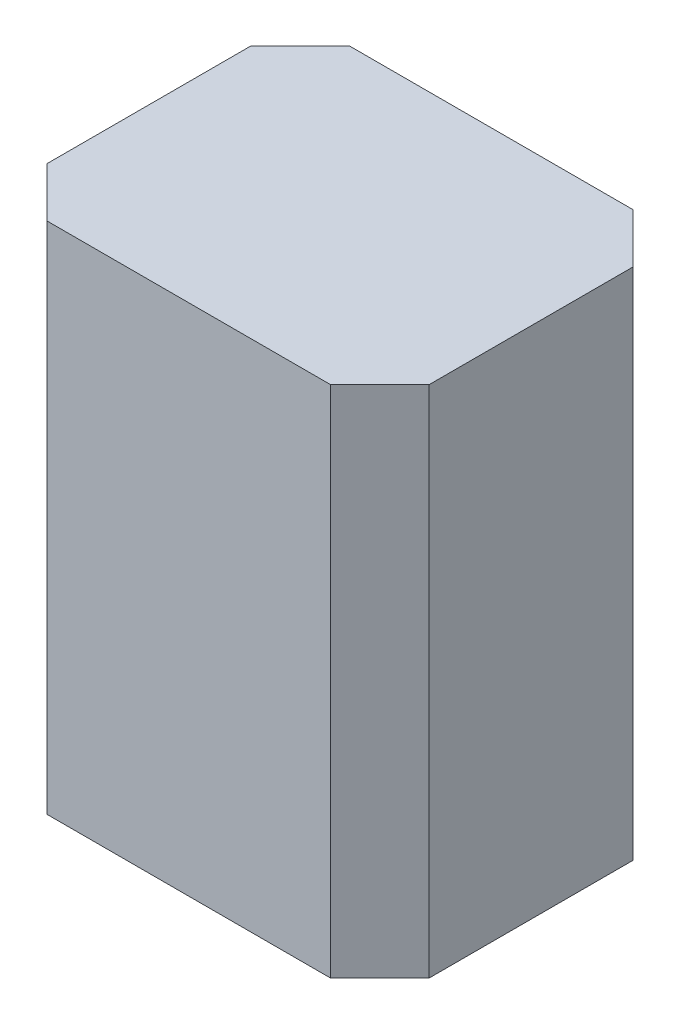
ISO-10303-21;
HEADER;
FILE_DESCRIPTION(('STEP AP214'),'2;1');
FILE_NAME('part.step','',(''),(''),'','','');
FILE_SCHEMA(('AUTOMOTIVE_DESIGN { 1 0 10303 214 1 1 1 1 }'));
ENDSEC;
DATA;
#1=APPLICATION_CONTEXT('core data for automotive mechanical design processes');
#2=APPLICATION_PROTOCOL_DEFINITION('international standard','automotive_design',2000,#1);
#3=PRODUCT_CONTEXT('',#1,'mechanical');
#4=PRODUCT('Part','Part','',(#3));
#5=PRODUCT_RELATED_PRODUCT_CATEGORY('part','',(#4));
#6=PRODUCT_DEFINITION_FORMATION('','',#4);
#7=PRODUCT_DEFINITION_CONTEXT('part definition',#1,'design');
#8=PRODUCT_DEFINITION('design','',#6,#7);
#9=PRODUCT_DEFINITION_SHAPE('','',#8);
#10=(LENGTH_UNIT() NAMED_UNIT(*) SI_UNIT(.MILLI.,.METRE.));
#11=(NAMED_UNIT(*) PLANE_ANGLE_UNIT() SI_UNIT($,.RADIAN.));
#12=(NAMED_UNIT(*) SI_UNIT($,.STERADIAN.) SOLID_ANGLE_UNIT());
#13=UNCERTAINTY_MEASURE_WITH_UNIT(LENGTH_MEASURE(1.E-05),#10,'distance_accuracy_value','');
#14=(GEOMETRIC_REPRESENTATION_CONTEXT(3) GLOBAL_UNCERTAINTY_ASSIGNED_CONTEXT((#13)) GLOBAL_UNIT_ASSIGNED_CONTEXT((#10,
#11,#12)) REPRESENTATION_CONTEXT('',''));
#15=CARTESIAN_POINT('',(0.,0.,0.));
#16=DIRECTION('',(0.,0.,1.));
#17=DIRECTION('',(1.,0.,0.));
#18=AXIS2_PLACEMENT_3D('',#15,#16,#17);
#19=CARTESIAN_POINT('',(-115.998,-95.,29.8292555518709));
#20=DIRECTION('',(0.,1.,0.));
#21=DIRECTION('',(0.,0.,1.));
#22=AXIS2_PLACEMENT_3D('',#19,#20,#21);
#23=PLANE('',#22);
#24=DIRECTION('',(0.,0.,-1.));
#25=VECTOR('',#24,1.);
#26=CARTESIAN_POINT('',(118.,-95.,41.));
#27=LINE('',#26,#25);
#28=CARTESIAN_POINT('',(118.,-95.,31.8284271247463));
#29=VERTEX_POINT('',#28);
#30=CARTESIAN_POINT('',(118.,-95.,31.));
#31=VERTEX_POINT('',#30);
#32=EDGE_CURVE('E251',#29,#31,#27,.T.);
#33=ORIENTED_EDGE('',*,*,#32,.F.);
#34=DIRECTION('',(0.707106781186548,0.,0.707106781186548));
#35=VECTOR('',#34,1.);
#36=CARTESIAN_POINT('',(87.5857864376269,-95.,1.41421356237307));
#37=LINE('',#36,#35);
#38=CARTESIAN_POINT('',(88.1721586616914,-95.,2.00058578643758));
#39=VERTEX_POINT('',#38);
#40=EDGE_CURVE('E234',#29,#39,#37,.F.);
#41=ORIENTED_EDGE('',*,*,#40,.T.);
#42=CARTESIAN_POINT('',(88.170744448129,-95.,2.00199999999996));
#43=DIRECTION('',(0.,-1.,0.));
#44=DIRECTION('',(0.,0.,-1.));
#45=AXIS2_PLACEMENT_3D('',#42,#43,#44);
#46=CIRCLE('',#45,0.00199999999999983);
#47=CARTESIAN_POINT('',(88.170744448129,-95.,1.99999999999996));
#48=VERTEX_POINT('',#47);
#49=EDGE_CURVE('E289',#39,#48,#46,.F.);
#50=ORIENTED_EDGE('',*,*,#49,.T.);
#51=DIRECTION('',(1.,0.,0.));
#52=VECTOR('',#51,1.);
#53=CARTESIAN_POINT('',(-89.,-95.,1.99999999999997));
#54=LINE('',#53,#52);
#55=CARTESIAN_POINT('',(25.,-95.,1.99999999999997));
#56=VERTEX_POINT('',#55);
#57=EDGE_CURVE('E292',#48,#56,#54,.F.);
#58=ORIENTED_EDGE('',*,*,#57,.T.);
#59=DIRECTION('',(0.,0.,1.));
#60=VECTOR('',#59,1.);
#61=CARTESIAN_POINT('',(25.,-95.,-22.));
#62=LINE('',#61,#60);
#63=CARTESIAN_POINT('',(25.,-95.,0.));
#64=VERTEX_POINT('',#63);
#65=EDGE_CURVE('E529',#64,#56,#62,.T.);
#66=ORIENTED_EDGE('',*,*,#65,.F.);
#67=DIRECTION('',(-1.,0.,0.));
#68=VECTOR('',#67,1.);
#69=CARTESIAN_POINT('',(-89.,-95.,0.));
#70=LINE('',#69,#68);
#71=CARTESIAN_POINT('',(89.,-95.,0.));
#72=VERTEX_POINT('',#71);
#73=EDGE_CURVE('E270',#72,#64,#70,.T.);
#74=ORIENTED_EDGE('',*,*,#73,.F.);
#75=DIRECTION('',(-0.707106781186548,0.,-0.707106781186548));
#76=VECTOR('',#75,1.);
#77=CARTESIAN_POINT('',(89.,-95.,0.));
#78=LINE('',#77,#76);
#79=CARTESIAN_POINT('',(120.,-95.,31.));
#80=VERTEX_POINT('',#79);
#81=EDGE_CURVE('E262',#80,#72,#78,.T.);
#82=ORIENTED_EDGE('',*,*,#81,.F.);
#83=DIRECTION('',(-1.,0.,0.));
#84=VECTOR('',#83,1.);
#85=CARTESIAN_POINT('',(120.,-95.,31.));
#86=LINE('',#85,#84);
#87=EDGE_CURVE('E259',#80,#31,#86,.T.);
#88=ORIENTED_EDGE('',*,*,#87,.T.);
#89=EDGE_LOOP('',(#33,#41,#50,#58,#66,#74,#82,#88));
#90=FACE_BOUND('',#89,.T.);
#91=ADVANCED_FACE('F17',(#90),#23,.F.);
#92=DIRECTION('',(0.707106781186547,0.,-0.707106781186548));
#93=VECTOR('',#92,1.);
#94=CARTESIAN_POINT('',(-116.585786437627,-95.,30.4142135623731));
#95=LINE('',#94,#93);
#96=CARTESIAN_POINT('',(-88.1721586616914,-95.,2.0005857864376));
#97=VERTEX_POINT('',#96);
#98=CARTESIAN_POINT('',(-118.,-95.,31.8284271247462));
#99=VERTEX_POINT('',#98);
#100=EDGE_CURVE('E285',#97,#99,#95,.F.);
#101=ORIENTED_EDGE('',*,*,#100,.T.);
#102=DIRECTION('',(0.,0.,1.));
#103=VECTOR('',#102,1.);
#104=CARTESIAN_POINT('',(-118.,-95.,29.));
#105=LINE('',#104,#103);
#106=CARTESIAN_POINT('',(-118.,-95.,31.));
#107=VERTEX_POINT('',#106);
#108=EDGE_CURVE('E268',#107,#99,#105,.T.);
#109=ORIENTED_EDGE('',*,*,#108,.F.);
#110=DIRECTION('',(1.,0.,0.));
#111=VECTOR('',#110,1.);
#112=CARTESIAN_POINT('',(-120.,-95.,31.));
#113=LINE('',#112,#111);
#114=CARTESIAN_POINT('',(-120.,-95.,31.));
#115=VERTEX_POINT('',#114);
#116=EDGE_CURVE('E496',#107,#115,#113,.F.);
#117=ORIENTED_EDGE('',*,*,#116,.T.);
#118=DIRECTION('',(-0.707106781186547,0.,0.707106781186548));
#119=VECTOR('',#118,1.);
#120=CARTESIAN_POINT('',(-118.,-95.,29.));
#121=LINE('',#120,#119);
#122=CARTESIAN_POINT('',(-89.,-95.,0.));
#123=VERTEX_POINT('',#122);
#124=EDGE_CURVE('E261',#123,#115,#121,.T.);
#125=ORIENTED_EDGE('',*,*,#124,.F.);
#126=CARTESIAN_POINT('',(-25.,-95.,0.));
#127=VERTEX_POINT('',#126);
#128=EDGE_CURVE('E277',#127,#123,#70,.T.);
#129=ORIENTED_EDGE('',*,*,#128,.F.);
#130=DIRECTION('',(0.,0.,1.));
#131=VECTOR('',#130,1.);
#132=CARTESIAN_POINT('',(-25.,-95.,-22.));
#133=LINE('',#132,#131);
#134=CARTESIAN_POINT('',(-25.,-95.,1.99999999999997));
#135=VERTEX_POINT('',#134);
#136=EDGE_CURVE('E544',#127,#135,#133,.T.);
#137=ORIENTED_EDGE('',*,*,#136,.T.);
#138=CARTESIAN_POINT('',(-88.170744448129,-95.,1.99999999999997));
#139=VERTEX_POINT('',#138);
#140=EDGE_CURVE('E282',#135,#139,#54,.F.);
#141=ORIENTED_EDGE('',*,*,#140,.T.);
#142=CARTESIAN_POINT('',(-88.170744448129,-95.,2.00199999999997));
#143=DIRECTION('',(0.,-1.,0.));
#144=DIRECTION('',(0.,0.,-1.));
#145=AXIS2_PLACEMENT_3D('',#142,#143,#144);
#146=CIRCLE('',#145,0.00199999999999983);
#147=EDGE_CURVE('E245',#139,#97,#146,.F.);
#148=ORIENTED_EDGE('',*,*,#147,.T.);
#149=EDGE_LOOP('',(#101,#109,#117,#125,#129,#137,#141,#148));
#150=FACE_BOUND('',#149,.T.);
#151=ADVANCED_FACE('F571',(#150),#23,.F.);
#152=CARTESIAN_POINT('',(-120.,-2.,31.));
#153=DIRECTION('',(0.707106781186548,0.,0.707106781186548));
#154=DIRECTION('',(0.707106781186548,0.,-0.707106781186548));
#155=AXIS2_PLACEMENT_3D('',#152,#153,#154);
#156=PLANE('',#155);
#157=DIRECTION('',(0.,1.,0.));
#158=VECTOR('',#157,1.);
#159=CARTESIAN_POINT('',(-89.,-2.,0.));
#160=LINE('',#159,#158);
#161=CARTESIAN_POINT('',(-89.,0.,0.));
#162=VERTEX_POINT('',#161);
#163=EDGE_CURVE('E11',#123,#162,#160,.T.);
#164=ORIENTED_EDGE('',*,*,#163,.F.);
#165=ORIENTED_EDGE('',*,*,#124,.T.);
#166=DIRECTION('',(0.,1.,0.));
#167=VECTOR('',#166,1.);
#168=CARTESIAN_POINT('',(-120.,-2.,31.));
#169=LINE('',#168,#167);
#170=CARTESIAN_POINT('',(-120.,0.,31.));
#171=VERTEX_POINT('',#170);
#172=EDGE_CURVE('E32',#115,#171,#169,.T.);
#173=ORIENTED_EDGE('',*,*,#172,.T.);
#174=DIRECTION('',(0.707106781186548,0.,-0.707106781186548));
#175=VECTOR('',#174,1.);
#176=CARTESIAN_POINT('',(-120.,0.,31.));
#177=LINE('',#176,#175);
#178=EDGE_CURVE('E433',#171,#162,#177,.T.);
#179=ORIENTED_EDGE('',*,*,#178,.T.);
#180=EDGE_LOOP('',(#164,#165,#173,#179));
#181=FACE_BOUND('',#180,.T.);
#182=ADVANCED_FACE('F19',(#181),#156,.F.);
#183=CARTESIAN_POINT('',(-89.,-2.,0.));
#184=DIRECTION('',(0.,0.,1.));
#185=DIRECTION('',(1.,0.,0.));
#186=AXIS2_PLACEMENT_3D('',#183,#184,#185);
#187=PLANE('',#186);
#188=ORIENTED_EDGE('',*,*,#128,.T.);
#189=ORIENTED_EDGE('',*,*,#163,.T.);
#190=DIRECTION('',(1.,0.,0.));
#191=VECTOR('',#190,1.);
#192=CARTESIAN_POINT('',(-89.,0.,0.));
#193=LINE('',#192,#191);
#194=CARTESIAN_POINT('',(89.,0.,0.));
#195=VERTEX_POINT('',#194);
#196=EDGE_CURVE('E434',#162,#195,#193,.T.);
#197=ORIENTED_EDGE('',*,*,#196,.T.);
#198=DIRECTION('',(0.,1.,0.));
#199=VECTOR('',#198,1.);
#200=CARTESIAN_POINT('',(89.,-2.,0.));
#201=LINE('',#200,#199);
#202=EDGE_CURVE('E25',#72,#195,#201,.T.);
#203=ORIENTED_EDGE('',*,*,#202,.F.);
#204=ORIENTED_EDGE('',*,*,#73,.T.);
#205=DIRECTION('',(0.,-1.,0.));
#206=VECTOR('',#205,1.);
#207=CARTESIAN_POINT('',(25.,-2.,0.));
#208=LINE('',#207,#206);
#209=CARTESIAN_POINT('',(25.,-48.,0.));
#210=VERTEX_POINT('',#209);
#211=EDGE_CURVE('E303',#210,#64,#208,.T.);
#212=ORIENTED_EDGE('',*,*,#211,.F.);
#213=DIRECTION('',(1.,0.,0.));
#214=VECTOR('',#213,1.);
#215=CARTESIAN_POINT('',(-89.,-48.,0.));
#216=LINE('',#215,#214);
#217=CARTESIAN_POINT('',(8.,-48.,0.));
#218=VERTEX_POINT('',#217);
#219=EDGE_CURVE('E306',#218,#210,#216,.T.);
#220=ORIENTED_EDGE('',*,*,#219,.F.);
#221=DIRECTION('',(0.,-1.,0.));
#222=VECTOR('',#221,1.);
#223=CARTESIAN_POINT('',(8.,-2.,0.));
#224=LINE('',#223,#222);
#225=CARTESIAN_POINT('',(8.,-14.,0.));
#226=VERTEX_POINT('',#225);
#227=EDGE_CURVE('E309',#226,#218,#224,.T.);
#228=ORIENTED_EDGE('',*,*,#227,.F.);
#229=DIRECTION('',(1.,0.,0.));
#230=VECTOR('',#229,1.);
#231=CARTESIAN_POINT('',(-89.,-14.,0.));
#232=LINE('',#231,#230);
#233=CARTESIAN_POINT('',(-8.,-14.,0.));
#234=VERTEX_POINT('',#233);
#235=EDGE_CURVE('E311',#234,#226,#232,.T.);
#236=ORIENTED_EDGE('',*,*,#235,.F.);
#237=DIRECTION('',(0.,1.,0.));
#238=VECTOR('',#237,1.);
#239=CARTESIAN_POINT('',(-8.,-2.,0.));
#240=LINE('',#239,#238);
#241=CARTESIAN_POINT('',(-8.,-48.,0.));
#242=VERTEX_POINT('',#241);
#243=EDGE_CURVE('E313',#242,#234,#240,.T.);
#244=ORIENTED_EDGE('',*,*,#243,.F.);
#245=DIRECTION('',(1.,0.,0.));
#246=VECTOR('',#245,1.);
#247=CARTESIAN_POINT('',(-89.,-48.,0.));
#248=LINE('',#247,#246);
#249=CARTESIAN_POINT('',(-25.,-48.,0.));
#250=VERTEX_POINT('',#249);
#251=EDGE_CURVE('E315',#250,#242,#248,.T.);
#252=ORIENTED_EDGE('',*,*,#251,.F.);
#253=DIRECTION('',(0.,1.,0.));
#254=VECTOR('',#253,1.);
#255=CARTESIAN_POINT('',(-25.,-2.,0.));
#256=LINE('',#255,#254);
#257=EDGE_CURVE('E317',#127,#250,#256,.T.);
#258=ORIENTED_EDGE('',*,*,#257,.F.);
#259=EDGE_LOOP('',(#188,#189,#197,#203,#204,#212,#220,#228,#236,#244,#252,#258));
#260=FACE_BOUND('',#259,.T.);
#261=ADVANCED_FACE('F568',(#260),#187,.F.);
#262=CARTESIAN_POINT('',(89.,-2.,0.));
#263=DIRECTION('',(-0.707106781186548,0.,0.707106781186548));
#264=DIRECTION('',(0.707106781186548,0.,0.707106781186548));
#265=AXIS2_PLACEMENT_3D('',#262,#263,#264);
#266=PLANE('',#265);
#267=DIRECTION('',(0.,1.,0.));
#268=VECTOR('',#267,1.);
#269=CARTESIAN_POINT('',(120.,-2.,31.));
#270=LINE('',#269,#268);
#271=CARTESIAN_POINT('',(120.,0.,31.));
#272=VERTEX_POINT('',#271);
#273=EDGE_CURVE('E40',#80,#272,#270,.T.);
#274=ORIENTED_EDGE('',*,*,#273,.F.);
#275=ORIENTED_EDGE('',*,*,#81,.T.);
#276=ORIENTED_EDGE('',*,*,#202,.T.);
#277=DIRECTION('',(0.707106781186548,0.,0.707106781186548));
#278=VECTOR('',#277,1.);
#279=CARTESIAN_POINT('',(89.,0.,0.));
#280=LINE('',#279,#278);
#281=EDGE_CURVE('E437',#195,#272,#280,.T.);
#282=ORIENTED_EDGE('',*,*,#281,.T.);
#283=EDGE_LOOP('',(#274,#275,#276,#282));
#284=FACE_BOUND('',#283,.T.);
#285=ADVANCED_FACE('F473',(#284),#266,.F.);
#286=CARTESIAN_POINT('',(120.,-2.,31.));
#287=DIRECTION('',(-1.,0.,0.));
#288=DIRECTION('',(0.,0.,1.));
#289=AXIS2_PLACEMENT_3D('',#286,#287,#288);
#290=PLANE('',#289);
#291=DIRECTION('',(0.,1.,0.));
#292=VECTOR('',#291,1.);
#293=CARTESIAN_POINT('',(120.,-2.,159.));
#294=LINE('',#293,#292);
#295=CARTESIAN_POINT('',(120.,-322.5,159.));
#296=VERTEX_POINT('',#295);
#297=CARTESIAN_POINT('',(120.,0.,159.));
#298=VERTEX_POINT('',#297);
#299=EDGE_CURVE('E468',#296,#298,#294,.T.);
#300=ORIENTED_EDGE('',*,*,#299,.F.);
#301=DIRECTION('',(0.,0.,-1.));
#302=VECTOR('',#301,1.);
#303=CARTESIAN_POINT('',(120.,-322.5,159.));
#304=LINE('',#303,#302);
#305=CARTESIAN_POINT('',(120.,-322.5,31.));
#306=VERTEX_POINT('',#305);
#307=EDGE_CURVE('E358',#296,#306,#304,.T.);
#308=ORIENTED_EDGE('',*,*,#307,.T.);
#309=DIRECTION('',(0.,1.,0.));
#310=VECTOR('',#309,1.);
#311=CARTESIAN_POINT('',(120.,-322.5,31.));
#312=LINE('',#311,#310);
#313=EDGE_CURVE('E361',#306,#80,#312,.T.);
#314=ORIENTED_EDGE('',*,*,#313,.T.);
#315=ORIENTED_EDGE('',*,*,#273,.T.);
#316=DIRECTION('',(0.,0.,1.));
#317=VECTOR('',#316,1.);
#318=CARTESIAN_POINT('',(120.,0.,31.));
#319=LINE('',#318,#317);
#320=EDGE_CURVE('E440',#272,#298,#319,.T.);
#321=ORIENTED_EDGE('',*,*,#320,.T.);
#322=EDGE_LOOP('',(#300,#308,#314,#315,#321));
#323=FACE_BOUND('',#322,.T.);
#324=ADVANCED_FACE('F483',(#323),#290,.F.);
#325=CARTESIAN_POINT('',(89.,-2.,190.));
#326=DIRECTION('',(-0.707106781186547,0.,-0.707106781186548));
#327=DIRECTION('',(-0.707106781186548,0.,0.707106781186547));
#328=AXIS2_PLACEMENT_3D('',#325,#326,#327);
#329=PLANE('',#328);
#330=DIRECTION('',(0.,1.,0.));
#331=VECTOR('',#330,1.);
#332=CARTESIAN_POINT('',(89.,-2.,190.));
#333=LINE('',#332,#331);
#334=CARTESIAN_POINT('',(89.,-322.5,190.));
#335=VERTEX_POINT('',#334);
#336=CARTESIAN_POINT('',(89.,0.,190.));
#337=VERTEX_POINT('',#336);
#338=EDGE_CURVE('E465',#335,#337,#333,.T.);
#339=ORIENTED_EDGE('',*,*,#338,.F.);
#340=DIRECTION('',(0.707106781186548,0.,-0.707106781186548));
#341=VECTOR('',#340,1.);
#342=CARTESIAN_POINT('',(89.,-322.5,190.));
#343=LINE('',#342,#341);
#344=EDGE_CURVE('E346',#335,#296,#343,.T.);
#345=ORIENTED_EDGE('',*,*,#344,.T.);
#346=ORIENTED_EDGE('',*,*,#299,.T.);
#347=DIRECTION('',(-0.707106781186548,0.,0.707106781186547));
#348=VECTOR('',#347,1.);
#349=CARTESIAN_POINT('',(89.,0.,190.));
#350=LINE('',#349,#348);
#351=EDGE_CURVE('E443',#298,#337,#350,.T.);
#352=ORIENTED_EDGE('',*,*,#351,.T.);
#353=EDGE_LOOP('',(#339,#345,#346,#352));
#354=FACE_BOUND('',#353,.T.);
#355=ADVANCED_FACE('F485',(#354),#329,.F.);
#356=CARTESIAN_POINT('',(89.,-2.,190.));
#357=DIRECTION('',(0.,0.,-1.));
#358=DIRECTION('',(-1.,0.,0.));
#359=AXIS2_PLACEMENT_3D('',#356,#357,#358);
#360=PLANE('',#359);
#361=DIRECTION('',(0.,1.,0.));
#362=VECTOR('',#361,1.);
#363=CARTESIAN_POINT('',(-89.,-2.,190.));
#364=LINE('',#363,#362);
#365=CARTESIAN_POINT('',(-89.,-322.5,190.));
#366=VERTEX_POINT('',#365);
#367=CARTESIAN_POINT('',(-89.,0.,190.));
#368=VERTEX_POINT('',#367);
#369=EDGE_CURVE('E462',#366,#368,#364,.T.);
#370=ORIENTED_EDGE('',*,*,#369,.F.);
#371=DIRECTION('',(1.,0.,0.));
#372=VECTOR('',#371,1.);
#373=CARTESIAN_POINT('',(-89.,-322.5,190.));
#374=LINE('',#373,#372);
#375=EDGE_CURVE('E341',#366,#335,#374,.T.);
#376=ORIENTED_EDGE('',*,*,#375,.T.);
#377=ORIENTED_EDGE('',*,*,#338,.T.);
#378=DIRECTION('',(-1.,0.,0.));
#379=VECTOR('',#378,1.);
#380=CARTESIAN_POINT('',(89.,0.,190.));
#381=LINE('',#380,#379);
#382=EDGE_CURVE('E446',#337,#368,#381,.T.);
#383=ORIENTED_EDGE('',*,*,#382,.T.);
#384=EDGE_LOOP('',(#370,#376,#377,#383));
#385=FACE_BOUND('',#384,.T.);
#386=ADVANCED_FACE('F586',(#385),#360,.F.);
#387=CARTESIAN_POINT('',(-89.,-2.,190.));
#388=DIRECTION('',(0.707106781186548,0.,-0.707106781186547));
#389=DIRECTION('',(-0.707106781186547,0.,-0.707106781186548));
#390=AXIS2_PLACEMENT_3D('',#387,#388,#389);
#391=PLANE('',#390);
#392=DIRECTION('',(0.,1.,0.));
#393=VECTOR('',#392,1.);
#394=CARTESIAN_POINT('',(-120.,-2.,159.));
#395=LINE('',#394,#393);
#396=CARTESIAN_POINT('',(-120.,-322.5,159.));
#397=VERTEX_POINT('',#396);
#398=CARTESIAN_POINT('',(-120.,0.,159.));
#399=VERTEX_POINT('',#398);
#400=EDGE_CURVE('E459',#397,#399,#395,.T.);
#401=ORIENTED_EDGE('',*,*,#400,.F.);
#402=DIRECTION('',(0.707106781186548,0.,0.707106781186548));
#403=VECTOR('',#402,1.);
#404=CARTESIAN_POINT('',(-120.,-322.5,159.));
#405=LINE('',#404,#403);
#406=EDGE_CURVE('E348',#397,#366,#405,.T.);
#407=ORIENTED_EDGE('',*,*,#406,.T.);
#408=ORIENTED_EDGE('',*,*,#369,.T.);
#409=DIRECTION('',(-0.707106781186547,0.,-0.707106781186548));
#410=VECTOR('',#409,1.);
#411=CARTESIAN_POINT('',(-89.,0.,190.));
#412=LINE('',#411,#410);
#413=EDGE_CURVE('E449',#368,#399,#412,.T.);
#414=ORIENTED_EDGE('',*,*,#413,.T.);
#415=EDGE_LOOP('',(#401,#407,#408,#414));
#416=FACE_BOUND('',#415,.T.);
#417=ADVANCED_FACE('F582',(#416),#391,.F.);
#418=CARTESIAN_POINT('',(-120.,-2.,159.));
#419=DIRECTION('',(1.,0.,0.));
#420=DIRECTION('',(0.,0.,-1.));
#421=AXIS2_PLACEMENT_3D('',#418,#419,#420);
#422=PLANE('',#421);
#423=DIRECTION('',(0.,0.,1.));
#424=VECTOR('',#423,1.);
#425=CARTESIAN_POINT('',(-120.,-322.5,31.));
#426=LINE('',#425,#424);
#427=CARTESIAN_POINT('',(-120.,-322.5,31.));
#428=VERTEX_POINT('',#427);
#429=EDGE_CURVE('E342',#428,#397,#426,.T.);
#430=ORIENTED_EDGE('',*,*,#429,.T.);
#431=ORIENTED_EDGE('',*,*,#400,.T.);
#432=DIRECTION('',(0.,0.,-1.));
#433=VECTOR('',#432,1.);
#434=CARTESIAN_POINT('',(-120.,0.,159.));
#435=LINE('',#434,#433);
#436=EDGE_CURVE('E452',#399,#171,#435,.T.);
#437=ORIENTED_EDGE('',*,*,#436,.T.);
#438=ORIENTED_EDGE('',*,*,#172,.F.);
#439=DIRECTION('',(0.,1.,0.));
#440=VECTOR('',#439,1.);
#441=CARTESIAN_POINT('',(-120.,-322.5,31.));
#442=LINE('',#441,#440);
#443=EDGE_CURVE('E347',#428,#115,#442,.T.);
#444=ORIENTED_EDGE('',*,*,#443,.F.);
#445=EDGE_LOOP('',(#430,#431,#437,#438,#444));
#446=FACE_BOUND('',#445,.T.);
#447=ADVANCED_FACE('F578',(#446),#422,.F.);
#448=CARTESIAN_POINT('',(0.,0.,-89.));
#449=DIRECTION('',(0.,-1.,0.));
#450=DIRECTION('',(0.,0.,-1.));
#451=AXIS2_PLACEMENT_3D('',#448,#449,#450);
#452=PLANE('',#451);
#453=ORIENTED_EDGE('',*,*,#351,.F.);
#454=ORIENTED_EDGE('',*,*,#320,.F.);
#455=ORIENTED_EDGE('',*,*,#281,.F.);
#456=ORIENTED_EDGE('',*,*,#196,.F.);
#457=ORIENTED_EDGE('',*,*,#178,.F.);
#458=ORIENTED_EDGE('',*,*,#436,.F.);
#459=ORIENTED_EDGE('',*,*,#413,.F.);
#460=ORIENTED_EDGE('',*,*,#382,.F.);
#461=EDGE_LOOP('',(#453,#454,#455,#456,#457,#458,#459,#460));
#462=FACE_BOUND('',#461,.T.);
#463=ADVANCED_FACE('F479',(#462),#452,.F.);
#464=CARTESIAN_POINT('',(-118.,-4.,41.));
#465=DIRECTION('',(0.,-1.,0.));
#466=DIRECTION('',(0.,0.,-1.));
#467=AXIS2_PLACEMENT_3D('',#464,#465,#466);
#468=PLANE('',#467);
#469=CARTESIAN_POINT('',(88.170744448129,-4.,2.00199999999996));
#470=DIRECTION('',(0.,1.,0.));
#471=DIRECTION('',(0.,0.,1.));
#472=AXIS2_PLACEMENT_3D('',#469,#470,#471);
#473=CIRCLE('',#472,0.00199999999999983);
#474=CARTESIAN_POINT('',(88.1721586616914,-4.,2.00058578643758));
#475=VERTEX_POINT('',#474);
#476=CARTESIAN_POINT('',(88.170744448129,-4.,1.99999999999996));
#477=VERTEX_POINT('',#476);
#478=EDGE_CURVE('E552',#475,#477,#473,.T.);
#479=ORIENTED_EDGE('',*,*,#478,.F.);
#480=DIRECTION('',(-0.707106781186547,0.,-0.707106781186548));
#481=VECTOR('',#480,1.);
#482=CARTESIAN_POINT('',(116.,-4.,29.8284271247464));
#483=LINE('',#482,#481);
#484=CARTESIAN_POINT('',(118.,-4.,31.8284271247463));
#485=VERTEX_POINT('',#484);
#486=EDGE_CURVE('E547',#485,#475,#483,.T.);
#487=ORIENTED_EDGE('',*,*,#486,.F.);
#488=DIRECTION('',(0.,0.,1.));
#489=VECTOR('',#488,1.);
#490=CARTESIAN_POINT('',(118.,-4.,158.171572875254));
#491=LINE('',#490,#489);
#492=CARTESIAN_POINT('',(118.,-4.,158.170744448129));
#493=VERTEX_POINT('',#492);
#494=EDGE_CURVE('E254',#485,#493,#491,.T.);
#495=ORIENTED_EDGE('',*,*,#494,.T.);
#496=CARTESIAN_POINT('',(117.998,-4.,158.170744448129));
#497=DIRECTION('',(0.,-1.,0.));
#498=DIRECTION('',(0.,0.,-1.));
#499=AXIS2_PLACEMENT_3D('',#496,#497,#498);
#500=CIRCLE('',#499,0.00199999999999983);
#501=CARTESIAN_POINT('',(117.999414213562,-4.,158.172158661692));
#502=VERTEX_POINT('',#501);
#503=EDGE_CURVE('E338',#502,#493,#500,.F.);
#504=ORIENTED_EDGE('',*,*,#503,.F.);
#505=DIRECTION('',(-0.707106781186548,0.,0.707106781186548));
#506=VECTOR('',#505,1.);
#507=CARTESIAN_POINT('',(88.171572875254,-4.,188.));
#508=LINE('',#507,#506);
#509=CARTESIAN_POINT('',(88.1721586616916,-4.,187.999414213563));
#510=VERTEX_POINT('',#509);
#511=EDGE_CURVE('E321',#502,#510,#508,.T.);
#512=ORIENTED_EDGE('',*,*,#511,.T.);
#513=CARTESIAN_POINT('',(88.1707444481292,-4.,187.998));
#514=DIRECTION('',(0.,-1.,0.));
#515=DIRECTION('',(0.,0.,-1.));
#516=AXIS2_PLACEMENT_3D('',#513,#514,#515);
#517=CIRCLE('',#516,0.00199999999999983);
#518=CARTESIAN_POINT('',(88.1707444481292,-4.,188.));
#519=VERTEX_POINT('',#518);
#520=EDGE_CURVE('E335',#519,#510,#517,.F.);
#521=ORIENTED_EDGE('',*,*,#520,.F.);
#522=DIRECTION('',(-1.,0.,0.));
#523=VECTOR('',#522,1.);
#524=CARTESIAN_POINT('',(-88.1715728752538,-4.,188.));
#525=LINE('',#524,#523);
#526=CARTESIAN_POINT('',(-88.170744448129,-4.,188.));
#527=VERTEX_POINT('',#526);
#528=EDGE_CURVE('E323',#519,#527,#525,.T.);
#529=ORIENTED_EDGE('',*,*,#528,.T.);
#530=CARTESIAN_POINT('',(-88.170744448129,-4.,187.998));
#531=DIRECTION('',(0.,-1.,0.));
#532=DIRECTION('',(0.,0.,-1.));
#533=AXIS2_PLACEMENT_3D('',#530,#531,#532);
#534=CIRCLE('',#533,0.00199999999999983);
#535=CARTESIAN_POINT('',(-88.1721586616914,-4.,187.999414213563));
#536=VERTEX_POINT('',#535);
#537=EDGE_CURVE('E327',#536,#527,#534,.F.);
#538=ORIENTED_EDGE('',*,*,#537,.F.);
#539=DIRECTION('',(-0.707106781186548,0.,-0.707106781186548));
#540=VECTOR('',#539,1.);
#541=CARTESIAN_POINT('',(-118.,-4.,158.171572875254));
#542=LINE('',#541,#540);
#543=CARTESIAN_POINT('',(-117.999414213562,-4.,158.172158661692));
#544=VERTEX_POINT('',#543);
#545=EDGE_CURVE('E325',#536,#544,#542,.T.);
#546=ORIENTED_EDGE('',*,*,#545,.T.);
#547=CARTESIAN_POINT('',(-117.998,-4.,158.170744448129));
#548=DIRECTION('',(0.,-1.,0.));
#549=DIRECTION('',(0.,0.,-1.));
#550=AXIS2_PLACEMENT_3D('',#547,#548,#549);
#551=CIRCLE('',#550,0.00199999999999983);
#552=CARTESIAN_POINT('',(-118.,-4.,158.170744448129));
#553=VERTEX_POINT('',#552);
#554=EDGE_CURVE('E332',#553,#544,#551,.F.);
#555=ORIENTED_EDGE('',*,*,#554,.F.);
#556=DIRECTION('',(0.,0.,-1.));
#557=VECTOR('',#556,1.);
#558=CARTESIAN_POINT('',(-118.,-4.,41.));
#559=LINE('',#558,#557);
#560=CARTESIAN_POINT('',(-118.,-4.,31.8284271247462));
#561=VERTEX_POINT('',#560);
#562=EDGE_CURVE('E319',#553,#561,#559,.T.);
#563=ORIENTED_EDGE('',*,*,#562,.T.);
#564=DIRECTION('',(-0.707106781186548,0.,0.707106781186548));
#565=VECTOR('',#564,1.);
#566=CARTESIAN_POINT('',(-88.1715728752538,-4.,1.99999999999997));
#567=LINE('',#566,#565);
#568=CARTESIAN_POINT('',(-88.1721586616914,-4.,2.0005857864376));
#569=VERTEX_POINT('',#568);
#570=EDGE_CURVE('E551',#569,#561,#567,.T.);
#571=ORIENTED_EDGE('',*,*,#570,.F.);
#572=CARTESIAN_POINT('',(-88.170744448129,-4.,2.00199999999997));
#573=DIRECTION('',(0.,1.,0.));
#574=DIRECTION('',(0.,0.,1.));
#575=AXIS2_PLACEMENT_3D('',#572,#573,#574);
#576=CIRCLE('',#575,0.00199999999999983);
#577=CARTESIAN_POINT('',(-88.170744448129,-4.,1.99999999999997));
#578=VERTEX_POINT('',#577);
#579=EDGE_CURVE('E273',#578,#569,#576,.T.);
#580=ORIENTED_EDGE('',*,*,#579,.F.);
#581=DIRECTION('',(-1.,0.,0.));
#582=VECTOR('',#581,1.);
#583=CARTESIAN_POINT('',(88.1715728752538,-4.,1.99999999999996));
#584=LINE('',#583,#582);
#585=EDGE_CURVE('E549',#477,#578,#584,.T.);
#586=ORIENTED_EDGE('',*,*,#585,.F.);
#587=EDGE_LOOP('',(#479,#487,#495,#504,#512,#521,#529,#538,#546,#555,#563,#571,#580,#586));
#588=FACE_BOUND('',#587,.T.);
#589=ADVANCED_FACE('F605',(#588),#468,.T.);
#590=CARTESIAN_POINT('',(118.,-322.5,159.));
#591=DIRECTION('',(1.,0.,0.));
#592=DIRECTION('',(0.,0.,-1.));
#593=AXIS2_PLACEMENT_3D('',#590,#591,#592);
#594=PLANE('',#593);
#595=DIRECTION('',(0.,-1.,0.));
#596=VECTOR('',#595,1.);
#597=CARTESIAN_POINT('',(118.,440.641709694446,31.8284271247463));
#598=LINE('',#597,#596);
#599=EDGE_CURVE('E237',#485,#29,#598,.T.);
#600=ORIENTED_EDGE('',*,*,#599,.T.);
#601=ORIENTED_EDGE('',*,*,#32,.T.);
#602=DIRECTION('',(0.,1.,0.));
#603=VECTOR('',#602,1.);
#604=CARTESIAN_POINT('',(118.,-322.5,31.));
#605=LINE('',#604,#603);
#606=CARTESIAN_POINT('',(118.,-322.5,31.));
#607=VERTEX_POINT('',#606);
#608=EDGE_CURVE('E426',#607,#31,#605,.T.);
#609=ORIENTED_EDGE('',*,*,#608,.F.);
#610=DIRECTION('',(0.,0.,-1.));
#611=VECTOR('',#610,1.);
#612=CARTESIAN_POINT('',(118.,-322.5,159.));
#613=LINE('',#612,#611);
#614=CARTESIAN_POINT('',(118.,-322.5,158.170744448129));
#615=VERTEX_POINT('',#614);
#616=EDGE_CURVE('E369',#615,#607,#613,.T.);
#617=ORIENTED_EDGE('',*,*,#616,.F.);
#618=DIRECTION('',(0.,1.,0.));
#619=VECTOR('',#618,1.);
#620=CARTESIAN_POINT('',(118.,-322.5,158.170744448129));
#621=LINE('',#620,#619);
#622=EDGE_CURVE('E367',#615,#493,#621,.T.);
#623=ORIENTED_EDGE('',*,*,#622,.T.);
#624=ORIENTED_EDGE('',*,*,#494,.F.);
#625=EDGE_LOOP('',(#600,#601,#609,#617,#623,#624));
#626=FACE_BOUND('',#625,.T.);
#627=ADVANCED_FACE('F249',(#626),#594,.F.);
#628=CARTESIAN_POINT('',(-118.,-322.5,31.));
#629=DIRECTION('',(-1.,0.,0.));
#630=DIRECTION('',(0.,0.,1.));
#631=AXIS2_PLACEMENT_3D('',#628,#629,#630);
#632=PLANE('',#631);
#633=ORIENTED_EDGE('',*,*,#108,.T.);
#634=DIRECTION('',(0.,-1.,0.));
#635=VECTOR('',#634,1.);
#636=CARTESIAN_POINT('',(-118.,440.641709694446,31.8284271247462));
#637=LINE('',#636,#635);
#638=EDGE_CURVE('E255',#561,#99,#637,.T.);
#639=ORIENTED_EDGE('',*,*,#638,.F.);
#640=ORIENTED_EDGE('',*,*,#562,.F.);
#641=DIRECTION('',(0.,1.,0.));
#642=VECTOR('',#641,1.);
#643=CARTESIAN_POINT('',(-118.,-322.5,158.170744448129));
#644=LINE('',#643,#642);
#645=CARTESIAN_POINT('',(-118.,-322.5,158.170744448129));
#646=VERTEX_POINT('',#645);
#647=EDGE_CURVE('E393',#646,#553,#644,.T.);
#648=ORIENTED_EDGE('',*,*,#647,.F.);
#649=DIRECTION('',(0.,0.,1.));
#650=VECTOR('',#649,1.);
#651=CARTESIAN_POINT('',(-118.,-322.5,31.));
#652=LINE('',#651,#650);
#653=CARTESIAN_POINT('',(-118.,-322.5,31.));
#654=VERTEX_POINT('',#653);
#655=EDGE_CURVE('E400',#654,#646,#652,.T.);
#656=ORIENTED_EDGE('',*,*,#655,.F.);
#657=DIRECTION('',(0.,1.,0.));
#658=VECTOR('',#657,1.);
#659=CARTESIAN_POINT('',(-118.,-322.5,31.));
#660=LINE('',#659,#658);
#661=EDGE_CURVE('E397',#654,#107,#660,.T.);
#662=ORIENTED_EDGE('',*,*,#661,.T.);
#663=EDGE_LOOP('',(#633,#639,#640,#648,#656,#662));
#664=FACE_BOUND('',#663,.T.);
#665=ADVANCED_FACE('F611',(#664),#632,.F.);
#666=CARTESIAN_POINT('',(-120.,-322.5,31.));
#667=DIRECTION('',(0.,-1.,0.));
#668=DIRECTION('',(0.,0.,1.));
#669=AXIS2_PLACEMENT_3D('',#666,#667,#668);
#670=PLANE('',#669);
#671=CARTESIAN_POINT('',(117.998,-322.5,158.170744448129));
#672=DIRECTION('',(0.,1.,0.));
#673=DIRECTION('',(0.,0.,1.));
#674=AXIS2_PLACEMENT_3D('',#671,#672,#673);
#675=CIRCLE('',#674,0.00199999999999983);
#676=CARTESIAN_POINT('',(117.999414213562,-322.5,158.172158661692));
#677=VERTEX_POINT('',#676);
#678=EDGE_CURVE('E370',#677,#615,#675,.T.);
#679=ORIENTED_EDGE('',*,*,#678,.T.);
#680=ORIENTED_EDGE('',*,*,#616,.T.);
#681=DIRECTION('',(-1.,0.,0.));
#682=VECTOR('',#681,1.);
#683=CARTESIAN_POINT('',(120.,-322.5,31.));
#684=LINE('',#683,#682);
#685=EDGE_CURVE('E430',#306,#607,#684,.T.);
#686=ORIENTED_EDGE('',*,*,#685,.F.);
#687=ORIENTED_EDGE('',*,*,#307,.F.);
#688=ORIENTED_EDGE('',*,*,#344,.F.);
#689=ORIENTED_EDGE('',*,*,#375,.F.);
#690=ORIENTED_EDGE('',*,*,#406,.F.);
#691=ORIENTED_EDGE('',*,*,#429,.F.);
#692=DIRECTION('',(1.,0.,0.));
#693=VECTOR('',#692,1.);
#694=CARTESIAN_POINT('',(-120.,-322.5,31.));
#695=LINE('',#694,#693);
#696=EDGE_CURVE('E428',#428,#654,#695,.T.);
#697=ORIENTED_EDGE('',*,*,#696,.T.);
#698=ORIENTED_EDGE('',*,*,#655,.T.);
#699=CARTESIAN_POINT('',(-117.998,-322.5,158.170744448129));
#700=DIRECTION('',(0.,1.,0.));
#701=DIRECTION('',(0.,0.,1.));
#702=AXIS2_PLACEMENT_3D('',#699,#700,#701);
#703=CIRCLE('',#702,0.00199999999999983);
#704=CARTESIAN_POINT('',(-117.999414213562,-322.5,158.172158661692));
#705=VERTEX_POINT('',#704);
#706=EDGE_CURVE('E396',#646,#705,#703,.T.);
#707=ORIENTED_EDGE('',*,*,#706,.T.);
#708=DIRECTION('',(0.707106781186548,0.,0.707106781186548));
#709=VECTOR('',#708,1.);
#710=CARTESIAN_POINT('',(-118.585786437627,-322.5,157.585786437627));
#711=LINE('',#710,#709);
#712=CARTESIAN_POINT('',(-88.1721586616914,-322.5,187.999414213563));
#713=VERTEX_POINT('',#712);
#714=EDGE_CURVE('E392',#705,#713,#711,.T.);
#715=ORIENTED_EDGE('',*,*,#714,.T.);
#716=CARTESIAN_POINT('',(-88.170744448129,-322.5,187.998));
#717=DIRECTION('',(0.,1.,0.));
#718=DIRECTION('',(0.,0.,1.));
#719=AXIS2_PLACEMENT_3D('',#716,#717,#718);
#720=CIRCLE('',#719,0.00199999999999983);
#721=CARTESIAN_POINT('',(-88.170744448129,-322.5,188.));
#722=VERTEX_POINT('',#721);
#723=EDGE_CURVE('E388',#713,#722,#720,.T.);
#724=ORIENTED_EDGE('',*,*,#723,.T.);
#725=DIRECTION('',(1.,0.,0.));
#726=VECTOR('',#725,1.);
#727=CARTESIAN_POINT('',(-89.,-322.5,188.));
#728=LINE('',#727,#726);
#729=CARTESIAN_POINT('',(88.1707444481292,-322.5,188.));
#730=VERTEX_POINT('',#729);
#731=EDGE_CURVE('E383',#722,#730,#728,.T.);
#732=ORIENTED_EDGE('',*,*,#731,.T.);
#733=CARTESIAN_POINT('',(88.1707444481292,-322.5,187.998));
#734=DIRECTION('',(0.,1.,0.));
#735=DIRECTION('',(0.,0.,1.));
#736=AXIS2_PLACEMENT_3D('',#733,#734,#735);
#737=CIRCLE('',#736,0.00199999999999983);
#738=CARTESIAN_POINT('',(88.1721586616916,-322.5,187.999414213563));
#739=VERTEX_POINT('',#738);
#740=EDGE_CURVE('E378',#730,#739,#737,.T.);
#741=ORIENTED_EDGE('',*,*,#740,.T.);
#742=DIRECTION('',(0.707106781186548,0.,-0.707106781186548));
#743=VECTOR('',#742,1.);
#744=CARTESIAN_POINT('',(87.585786437627,-322.5,188.585786437627));
#745=LINE('',#744,#743);
#746=EDGE_CURVE('E374',#739,#677,#745,.T.);
#747=ORIENTED_EDGE('',*,*,#746,.T.);
#748=EDGE_LOOP('',(#679,#680,#686,#687,#688,#689,#690,#691,#697,#698,#707,#715,#724,#732,#741,#747));
#749=FACE_BOUND('',#748,.T.);
#750=ADVANCED_FACE('F491',(#749),#670,.T.);
#751=CARTESIAN_POINT('',(-120.,-322.5,31.));
#752=DIRECTION('',(0.,0.,1.));
#753=DIRECTION('',(0.,1.,0.));
#754=AXIS2_PLACEMENT_3D('',#751,#752,#753);
#755=PLANE('',#754);
#756=ORIENTED_EDGE('',*,*,#116,.F.);
#757=ORIENTED_EDGE('',*,*,#661,.F.);
#758=ORIENTED_EDGE('',*,*,#696,.F.);
#759=ORIENTED_EDGE('',*,*,#443,.T.);
#760=EDGE_LOOP('',(#756,#757,#758,#759));
#761=FACE_BOUND('',#760,.T.);
#762=ADVANCED_FACE('F575',(#761),#755,.F.);
#763=CARTESIAN_POINT('',(120.,-322.5,31.));
#764=DIRECTION('',(0.,0.,-1.));
#765=DIRECTION('',(0.,1.,0.));
#766=AXIS2_PLACEMENT_3D('',#763,#764,#765);
#767=PLANE('',#766);
#768=ORIENTED_EDGE('',*,*,#87,.F.);
#769=ORIENTED_EDGE('',*,*,#313,.F.);
#770=ORIENTED_EDGE('',*,*,#685,.T.);
#771=ORIENTED_EDGE('',*,*,#608,.T.);
#772=EDGE_LOOP('',(#768,#769,#770,#771));
#773=FACE_BOUND('',#772,.T.);
#774=ADVANCED_FACE('F494',(#773),#767,.T.);
#775=CARTESIAN_POINT('',(117.998,-322.5,158.170744448129));
#776=DIRECTION('',(0.,1.,0.));
#777=DIRECTION('',(0.,0.,1.));
#778=AXIS2_PLACEMENT_3D('',#775,#776,#777);
#779=CYLINDRICAL_SURFACE('',#778,0.00199999999999983);
#780=DIRECTION('',(0.,1.,0.));
#781=VECTOR('',#780,1.);
#782=CARTESIAN_POINT('',(117.999414213562,-322.5,158.172158661692));
#783=LINE('',#782,#781);
#784=EDGE_CURVE('E371',#677,#502,#783,.T.);
#785=ORIENTED_EDGE('',*,*,#784,.T.);
#786=ORIENTED_EDGE('',*,*,#503,.T.);
#787=ORIENTED_EDGE('',*,*,#622,.F.);
#788=ORIENTED_EDGE('',*,*,#678,.F.);
#789=EDGE_LOOP('',(#785,#786,#787,#788));
#790=FACE_BOUND('',#789,.T.);
#791=ADVANCED_FACE('F612',(#790),#779,.F.);
#792=CARTESIAN_POINT('',(87.585786437627,-322.5,188.585786437627));
#793=DIRECTION('',(0.707106781186548,0.,0.707106781186548));
#794=DIRECTION('',(0.707106781186548,0.,-0.707106781186548));
#795=AXIS2_PLACEMENT_3D('',#792,#793,#794);
#796=PLANE('',#795);
#797=DIRECTION('',(0.,1.,0.));
#798=VECTOR('',#797,1.);
#799=CARTESIAN_POINT('',(88.1721586616916,-322.5,187.999414213563));
#800=LINE('',#799,#798);
#801=EDGE_CURVE('E375',#739,#510,#800,.T.);
#802=ORIENTED_EDGE('',*,*,#801,.T.);
#803=ORIENTED_EDGE('',*,*,#511,.F.);
#804=ORIENTED_EDGE('',*,*,#784,.F.);
#805=ORIENTED_EDGE('',*,*,#746,.F.);
#806=EDGE_LOOP('',(#802,#803,#804,#805));
#807=FACE_BOUND('',#806,.T.);
#808=ADVANCED_FACE('F615',(#807),#796,.F.);
#809=CARTESIAN_POINT('',(88.1707444481292,-322.5,187.998));
#810=DIRECTION('',(0.,1.,0.));
#811=DIRECTION('',(0.,0.,1.));
#812=AXIS2_PLACEMENT_3D('',#809,#810,#811);
#813=CYLINDRICAL_SURFACE('',#812,0.00199999999999983);
#814=DIRECTION('',(0.,1.,0.));
#815=VECTOR('',#814,1.);
#816=CARTESIAN_POINT('',(88.1707444481292,-322.5,188.));
#817=LINE('',#816,#815);
#818=EDGE_CURVE('E379',#730,#519,#817,.T.);
#819=ORIENTED_EDGE('',*,*,#818,.T.);
#820=ORIENTED_EDGE('',*,*,#520,.T.);
#821=ORIENTED_EDGE('',*,*,#801,.F.);
#822=ORIENTED_EDGE('',*,*,#740,.F.);
#823=EDGE_LOOP('',(#819,#820,#821,#822));
#824=FACE_BOUND('',#823,.T.);
#825=ADVANCED_FACE('F619',(#824),#813,.F.);
#826=CARTESIAN_POINT('',(-117.998,-322.5,158.170744448129));
#827=DIRECTION('',(0.,1.,0.));
#828=DIRECTION('',(0.,0.,1.));
#829=AXIS2_PLACEMENT_3D('',#826,#827,#828);
#830=CYLINDRICAL_SURFACE('',#829,0.00199999999999983);
#831=ORIENTED_EDGE('',*,*,#647,.T.);
#832=ORIENTED_EDGE('',*,*,#554,.T.);
#833=DIRECTION('',(0.,1.,0.));
#834=VECTOR('',#833,1.);
#835=CARTESIAN_POINT('',(-117.999414213562,-322.5,158.172158661692));
#836=LINE('',#835,#834);
#837=EDGE_CURVE('E389',#705,#544,#836,.T.);
#838=ORIENTED_EDGE('',*,*,#837,.F.);
#839=ORIENTED_EDGE('',*,*,#706,.F.);
#840=EDGE_LOOP('',(#831,#832,#838,#839));
#841=FACE_BOUND('',#840,.T.);
#842=ADVANCED_FACE('F623',(#841),#830,.F.);
#843=CARTESIAN_POINT('',(-118.585786437627,-322.5,157.585786437627));
#844=DIRECTION('',(-0.707106781186548,0.,0.707106781186548));
#845=DIRECTION('',(0.707106781186548,0.,0.707106781186548));
#846=AXIS2_PLACEMENT_3D('',#843,#844,#845);
#847=PLANE('',#846);
#848=ORIENTED_EDGE('',*,*,#837,.T.);
#849=ORIENTED_EDGE('',*,*,#545,.F.);
#850=DIRECTION('',(0.,1.,0.));
#851=VECTOR('',#850,1.);
#852=CARTESIAN_POINT('',(-88.1721586616914,-322.5,187.999414213563));
#853=LINE('',#852,#851);
#854=EDGE_CURVE('E382',#713,#536,#853,.T.);
#855=ORIENTED_EDGE('',*,*,#854,.F.);
#856=ORIENTED_EDGE('',*,*,#714,.F.);
#857=EDGE_LOOP('',(#848,#849,#855,#856));
#858=FACE_BOUND('',#857,.T.);
#859=ADVANCED_FACE('F630',(#858),#847,.F.);
#860=CARTESIAN_POINT('',(-88.170744448129,-322.5,187.998));
#861=DIRECTION('',(0.,1.,0.));
#862=DIRECTION('',(0.,0.,1.));
#863=AXIS2_PLACEMENT_3D('',#860,#861,#862);
#864=CYLINDRICAL_SURFACE('',#863,0.00199999999999983);
#865=ORIENTED_EDGE('',*,*,#854,.T.);
#866=ORIENTED_EDGE('',*,*,#537,.T.);
#867=DIRECTION('',(0.,1.,0.));
#868=VECTOR('',#867,1.);
#869=CARTESIAN_POINT('',(-88.170744448129,-322.5,188.));
#870=LINE('',#869,#868);
#871=EDGE_CURVE('E364',#722,#527,#870,.T.);
#872=ORIENTED_EDGE('',*,*,#871,.F.);
#873=ORIENTED_EDGE('',*,*,#723,.F.);
#874=EDGE_LOOP('',(#865,#866,#872,#873));
#875=FACE_BOUND('',#874,.T.);
#876=ADVANCED_FACE('F634',(#875),#864,.F.);
#877=CARTESIAN_POINT('',(-89.,-322.5,188.));
#878=DIRECTION('',(0.,0.,1.));
#879=DIRECTION('',(1.,0.,0.));
#880=AXIS2_PLACEMENT_3D('',#877,#878,#879);
#881=PLANE('',#880);
#882=ORIENTED_EDGE('',*,*,#871,.T.);
#883=ORIENTED_EDGE('',*,*,#528,.F.);
#884=ORIENTED_EDGE('',*,*,#818,.F.);
#885=ORIENTED_EDGE('',*,*,#731,.F.);
#886=EDGE_LOOP('',(#882,#883,#884,#885));
#887=FACE_BOUND('',#886,.T.);
#888=ADVANCED_FACE('F638',(#887),#881,.F.);
#889=CARTESIAN_POINT('',(-89.,-2.,1.99999999999997));
#890=DIRECTION('',(0.,0.,1.));
#891=DIRECTION('',(1.,0.,0.));
#892=AXIS2_PLACEMENT_3D('',#889,#890,#891);
#893=PLANE('',#892);
#894=ORIENTED_EDGE('',*,*,#585,.T.);
#895=DIRECTION('',(0.,1.,0.));
#896=VECTOR('',#895,1.);
#897=CARTESIAN_POINT('',(-88.170744448129,-2.,1.99999999999997));
#898=LINE('',#897,#896);
#899=EDGE_CURVE('E286',#578,#139,#898,.F.);
#900=ORIENTED_EDGE('',*,*,#899,.T.);
#901=ORIENTED_EDGE('',*,*,#140,.F.);
#902=DIRECTION('',(0.,1.,0.));
#903=VECTOR('',#902,1.);
#904=CARTESIAN_POINT('',(-25.,-95.,1.99999999999997));
#905=LINE('',#904,#903);
#906=CARTESIAN_POINT('',(-25.,-48.,1.99999999999997));
#907=VERTEX_POINT('',#906);
#908=EDGE_CURVE('E495',#135,#907,#905,.T.);
#909=ORIENTED_EDGE('',*,*,#908,.T.);
#910=DIRECTION('',(1.,0.,0.));
#911=VECTOR('',#910,1.);
#912=CARTESIAN_POINT('',(-25.,-48.,1.99999999999997));
#913=LINE('',#912,#911);
#914=CARTESIAN_POINT('',(-8.,-48.,1.99999999999997));
#915=VERTEX_POINT('',#914);
#916=EDGE_CURVE('E500',#907,#915,#913,.T.);
#917=ORIENTED_EDGE('',*,*,#916,.T.);
#918=DIRECTION('',(0.,1.,0.));
#919=VECTOR('',#918,1.);
#920=CARTESIAN_POINT('',(-8.,-48.,1.99999999999997));
#921=LINE('',#920,#919);
#922=CARTESIAN_POINT('',(-8.,-14.,1.99999999999997));
#923=VERTEX_POINT('',#922);
#924=EDGE_CURVE('E509',#915,#923,#921,.T.);
#925=ORIENTED_EDGE('',*,*,#924,.T.);
#926=DIRECTION('',(1.,0.,0.));
#927=VECTOR('',#926,1.);
#928=CARTESIAN_POINT('',(-8.,-14.,1.99999999999997));
#929=LINE('',#928,#927);
#930=CARTESIAN_POINT('',(8.,-14.,1.99999999999997));
#931=VERTEX_POINT('',#930);
#932=EDGE_CURVE('E513',#923,#931,#929,.T.);
#933=ORIENTED_EDGE('',*,*,#932,.T.);
#934=DIRECTION('',(0.,-1.,0.));
#935=VECTOR('',#934,1.);
#936=CARTESIAN_POINT('',(8.,-14.,1.99999999999997));
#937=LINE('',#936,#935);
#938=CARTESIAN_POINT('',(8.,-48.,1.99999999999997));
#939=VERTEX_POINT('',#938);
#940=EDGE_CURVE('E517',#931,#939,#937,.T.);
#941=ORIENTED_EDGE('',*,*,#940,.T.);
#942=DIRECTION('',(1.,0.,0.));
#943=VECTOR('',#942,1.);
#944=CARTESIAN_POINT('',(8.,-48.,1.99999999999997));
#945=LINE('',#944,#943);
#946=CARTESIAN_POINT('',(25.,-48.,1.99999999999997));
#947=VERTEX_POINT('',#946);
#948=EDGE_CURVE('E521',#939,#947,#945,.T.);
#949=ORIENTED_EDGE('',*,*,#948,.T.);
#950=DIRECTION('',(0.,-1.,0.));
#951=VECTOR('',#950,1.);
#952=CARTESIAN_POINT('',(25.,-48.,1.99999999999997));
#953=LINE('',#952,#951);
#954=EDGE_CURVE('E525',#947,#56,#953,.T.);
#955=ORIENTED_EDGE('',*,*,#954,.T.);
#956=ORIENTED_EDGE('',*,*,#57,.F.);
#957=DIRECTION('',(0.,-1.,0.));
#958=VECTOR('',#957,1.);
#959=CARTESIAN_POINT('',(88.170744448129,-2.,1.99999999999996));
#960=LINE('',#959,#958);
#961=EDGE_CURVE('E290',#477,#48,#960,.T.);
#962=ORIENTED_EDGE('',*,*,#961,.F.);
#963=EDGE_LOOP('',(#894,#900,#901,#909,#917,#925,#933,#941,#949,#955,#956,#962));
#964=FACE_BOUND('',#963,.T.);
#965=ADVANCED_FACE('F603',(#964),#893,.T.);
#966=CARTESIAN_POINT('',(-116.585786437627,-2.,30.4142135623731));
#967=DIRECTION('',(0.707106781186548,0.,0.707106781186547));
#968=DIRECTION('',(0.707106781186547,0.,-0.707106781186548));
#969=AXIS2_PLACEMENT_3D('',#966,#967,#968);
#970=PLANE('',#969);
#971=ORIENTED_EDGE('',*,*,#638,.T.);
#972=ORIENTED_EDGE('',*,*,#100,.F.);
#973=DIRECTION('',(0.,-1.,0.));
#974=VECTOR('',#973,1.);
#975=CARTESIAN_POINT('',(-88.1721586616914,-2.,2.0005857864376));
#976=LINE('',#975,#974);
#977=EDGE_CURVE('E283',#569,#97,#976,.T.);
#978=ORIENTED_EDGE('',*,*,#977,.F.);
#979=ORIENTED_EDGE('',*,*,#570,.T.);
#980=EDGE_LOOP('',(#971,#972,#978,#979));
#981=FACE_BOUND('',#980,.T.);
#982=ADVANCED_FACE('F733',(#981),#970,.T.);
#983=CARTESIAN_POINT('',(-88.170744448129,-2.,2.00199999999997));
#984=DIRECTION('',(0.,-1.,0.));
#985=DIRECTION('',(0.,0.,-1.));
#986=AXIS2_PLACEMENT_3D('',#983,#984,#985);
#987=CYLINDRICAL_SURFACE('',#986,0.00199999999999983);
#988=ORIENTED_EDGE('',*,*,#899,.F.);
#989=ORIENTED_EDGE('',*,*,#579,.T.);
#990=ORIENTED_EDGE('',*,*,#977,.T.);
#991=ORIENTED_EDGE('',*,*,#147,.F.);
#992=EDGE_LOOP('',(#988,#989,#990,#991));
#993=FACE_BOUND('',#992,.T.);
#994=ADVANCED_FACE('F741',(#993),#987,.F.);
#995=CARTESIAN_POINT('',(87.5857864376269,-2.,1.41421356237307));
#996=DIRECTION('',(-0.707106781186548,0.,0.707106781186548));
#997=DIRECTION('',(0.707106781186548,0.,0.707106781186548));
#998=AXIS2_PLACEMENT_3D('',#995,#996,#997);
#999=PLANE('',#998);
#1000=ORIENTED_EDGE('',*,*,#486,.T.);
#1001=DIRECTION('',(0.,1.,0.));
#1002=VECTOR('',#1001,1.);
#1003=CARTESIAN_POINT('',(88.1721586616914,-2.,2.00058578643758));
#1004=LINE('',#1003,#1002);
#1005=EDGE_CURVE('E239',#475,#39,#1004,.F.);
#1006=ORIENTED_EDGE('',*,*,#1005,.T.);
#1007=ORIENTED_EDGE('',*,*,#40,.F.);
#1008=ORIENTED_EDGE('',*,*,#599,.F.);
#1009=EDGE_LOOP('',(#1000,#1006,#1007,#1008));
#1010=FACE_BOUND('',#1009,.T.);
#1011=ADVANCED_FACE('F236',(#1010),#999,.T.);
#1012=CARTESIAN_POINT('',(88.170744448129,-2.,2.00199999999996));
#1013=DIRECTION('',(0.,-1.,0.));
#1014=DIRECTION('',(0.,0.,-1.));
#1015=AXIS2_PLACEMENT_3D('',#1012,#1013,#1014);
#1016=CYLINDRICAL_SURFACE('',#1015,0.00199999999999983);
#1017=ORIENTED_EDGE('',*,*,#1005,.F.);
#1018=ORIENTED_EDGE('',*,*,#478,.T.);
#1019=ORIENTED_EDGE('',*,*,#961,.T.);
#1020=ORIENTED_EDGE('',*,*,#49,.F.);
#1021=EDGE_LOOP('',(#1017,#1018,#1019,#1020));
#1022=FACE_BOUND('',#1021,.T.);
#1023=ADVANCED_FACE('F756',(#1022),#1016,.F.);
#1024=CARTESIAN_POINT('',(-25.,-95.,-22.));
#1025=DIRECTION('',(1.,0.,0.));
#1026=DIRECTION('',(0.,0.,-1.));
#1027=AXIS2_PLACEMENT_3D('',#1024,#1025,#1026);
#1028=PLANE('',#1027);
#1029=ORIENTED_EDGE('',*,*,#257,.T.);
#1030=DIRECTION('',(0.,0.,1.));
#1031=VECTOR('',#1030,1.);
#1032=CARTESIAN_POINT('',(-25.,-48.,-22.));
#1033=LINE('',#1032,#1031);
#1034=EDGE_CURVE('E542',#250,#907,#1033,.T.);
#1035=ORIENTED_EDGE('',*,*,#1034,.T.);
#1036=ORIENTED_EDGE('',*,*,#908,.F.);
#1037=ORIENTED_EDGE('',*,*,#136,.F.);
#1038=EDGE_LOOP('',(#1029,#1035,#1036,#1037));
#1039=FACE_BOUND('',#1038,.T.);
#1040=ADVANCED_FACE('F762',(#1039),#1028,.T.);
#1041=CARTESIAN_POINT('',(-25.,-48.,-22.));
#1042=DIRECTION('',(0.,-1.,0.));
#1043=DIRECTION('',(0.,0.,-1.));
#1044=AXIS2_PLACEMENT_3D('',#1041,#1042,#1043);
#1045=PLANE('',#1044);
#1046=ORIENTED_EDGE('',*,*,#251,.T.);
#1047=DIRECTION('',(0.,0.,1.));
#1048=VECTOR('',#1047,1.);
#1049=CARTESIAN_POINT('',(-8.,-48.,-22.));
#1050=LINE('',#1049,#1048);
#1051=EDGE_CURVE('E540',#242,#915,#1050,.T.);
#1052=ORIENTED_EDGE('',*,*,#1051,.T.);
#1053=ORIENTED_EDGE('',*,*,#916,.F.);
#1054=ORIENTED_EDGE('',*,*,#1034,.F.);
#1055=EDGE_LOOP('',(#1046,#1052,#1053,#1054));
#1056=FACE_BOUND('',#1055,.T.);
#1057=ADVANCED_FACE('F769',(#1056),#1045,.T.);
#1058=CARTESIAN_POINT('',(-8.,-48.,-22.));
#1059=DIRECTION('',(1.,0.,0.));
#1060=DIRECTION('',(0.,1.,0.));
#1061=AXIS2_PLACEMENT_3D('',#1058,#1059,#1060);
#1062=PLANE('',#1061);
#1063=ORIENTED_EDGE('',*,*,#243,.T.);
#1064=DIRECTION('',(0.,0.,1.));
#1065=VECTOR('',#1064,1.);
#1066=CARTESIAN_POINT('',(-8.,-14.,-22.));
#1067=LINE('',#1066,#1065);
#1068=EDGE_CURVE('E538',#234,#923,#1067,.T.);
#1069=ORIENTED_EDGE('',*,*,#1068,.T.);
#1070=ORIENTED_EDGE('',*,*,#924,.F.);
#1071=ORIENTED_EDGE('',*,*,#1051,.F.);
#1072=EDGE_LOOP('',(#1063,#1069,#1070,#1071));
#1073=FACE_BOUND('',#1072,.T.);
#1074=ADVANCED_FACE('F778',(#1073),#1062,.T.);
#1075=CARTESIAN_POINT('',(-8.,-14.,-22.));
#1076=DIRECTION('',(0.,-1.,0.));
#1077=DIRECTION('',(0.,0.,-1.));
#1078=AXIS2_PLACEMENT_3D('',#1075,#1076,#1077);
#1079=PLANE('',#1078);
#1080=ORIENTED_EDGE('',*,*,#235,.T.);
#1081=DIRECTION('',(0.,0.,1.));
#1082=VECTOR('',#1081,1.);
#1083=CARTESIAN_POINT('',(8.,-14.,-22.));
#1084=LINE('',#1083,#1082);
#1085=EDGE_CURVE('E536',#226,#931,#1084,.T.);
#1086=ORIENTED_EDGE('',*,*,#1085,.T.);
#1087=ORIENTED_EDGE('',*,*,#932,.F.);
#1088=ORIENTED_EDGE('',*,*,#1068,.F.);
#1089=EDGE_LOOP('',(#1080,#1086,#1087,#1088));
#1090=FACE_BOUND('',#1089,.T.);
#1091=ADVANCED_FACE('F787',(#1090),#1079,.T.);
#1092=CARTESIAN_POINT('',(8.,-14.,-22.));
#1093=DIRECTION('',(-1.,0.,0.));
#1094=DIRECTION('',(0.,-1.,0.));
#1095=AXIS2_PLACEMENT_3D('',#1092,#1093,#1094);
#1096=PLANE('',#1095);
#1097=ORIENTED_EDGE('',*,*,#227,.T.);
#1098=DIRECTION('',(0.,0.,1.));
#1099=VECTOR('',#1098,1.);
#1100=CARTESIAN_POINT('',(8.,-48.,-22.));
#1101=LINE('',#1100,#1099);
#1102=EDGE_CURVE('E534',#218,#939,#1101,.T.);
#1103=ORIENTED_EDGE('',*,*,#1102,.T.);
#1104=ORIENTED_EDGE('',*,*,#940,.F.);
#1105=ORIENTED_EDGE('',*,*,#1085,.F.);
#1106=EDGE_LOOP('',(#1097,#1103,#1104,#1105));
#1107=FACE_BOUND('',#1106,.T.);
#1108=ADVANCED_FACE('F796',(#1107),#1096,.T.);
#1109=CARTESIAN_POINT('',(8.,-48.,-22.));
#1110=DIRECTION('',(0.,-1.,0.));
#1111=DIRECTION('',(0.,0.,-1.));
#1112=AXIS2_PLACEMENT_3D('',#1109,#1110,#1111);
#1113=PLANE('',#1112);
#1114=ORIENTED_EDGE('',*,*,#219,.T.);
#1115=DIRECTION('',(0.,0.,1.));
#1116=VECTOR('',#1115,1.);
#1117=CARTESIAN_POINT('',(25.,-48.,-22.));
#1118=LINE('',#1117,#1116);
#1119=EDGE_CURVE('E532',#210,#947,#1118,.T.);
#1120=ORIENTED_EDGE('',*,*,#1119,.T.);
#1121=ORIENTED_EDGE('',*,*,#948,.F.);
#1122=ORIENTED_EDGE('',*,*,#1102,.F.);
#1123=EDGE_LOOP('',(#1114,#1120,#1121,#1122));
#1124=FACE_BOUND('',#1123,.T.);
#1125=ADVANCED_FACE('F805',(#1124),#1113,.T.);
#1126=CARTESIAN_POINT('',(25.,-48.,-22.));
#1127=DIRECTION('',(-1.,0.,0.));
#1128=DIRECTION('',(0.,0.,1.));
#1129=AXIS2_PLACEMENT_3D('',#1126,#1127,#1128);
#1130=PLANE('',#1129);
#1131=ORIENTED_EDGE('',*,*,#211,.T.);
#1132=ORIENTED_EDGE('',*,*,#65,.T.);
#1133=ORIENTED_EDGE('',*,*,#954,.F.);
#1134=ORIENTED_EDGE('',*,*,#1119,.F.);
#1135=EDGE_LOOP('',(#1131,#1132,#1133,#1134));
#1136=FACE_BOUND('',#1135,.T.);
#1137=ADVANCED_FACE('F814',(#1136),#1130,.T.);
#1138=CLOSED_SHELL('',(#91,#151,#182,#261,#285,#324,#355,#386,#417,#447,#463,#589,#627,#665,
#750,#762,#774,#791,#808,#825,#842,#859,#876,#888,#965,#982,#994,#1011,#1023,#1040,#1057,#1074,
#1091,#1108,#1125,#1137));
#1139=MANIFOLD_SOLID_BREP('B1',#1138);
#1140=ADVANCED_BREP_SHAPE_REPRESENTATION('',(#18,#1139),#14);
#1141=SHAPE_DEFINITION_REPRESENTATION(#9,#1140);
ENDSEC;
END-ISO-10303-21;
